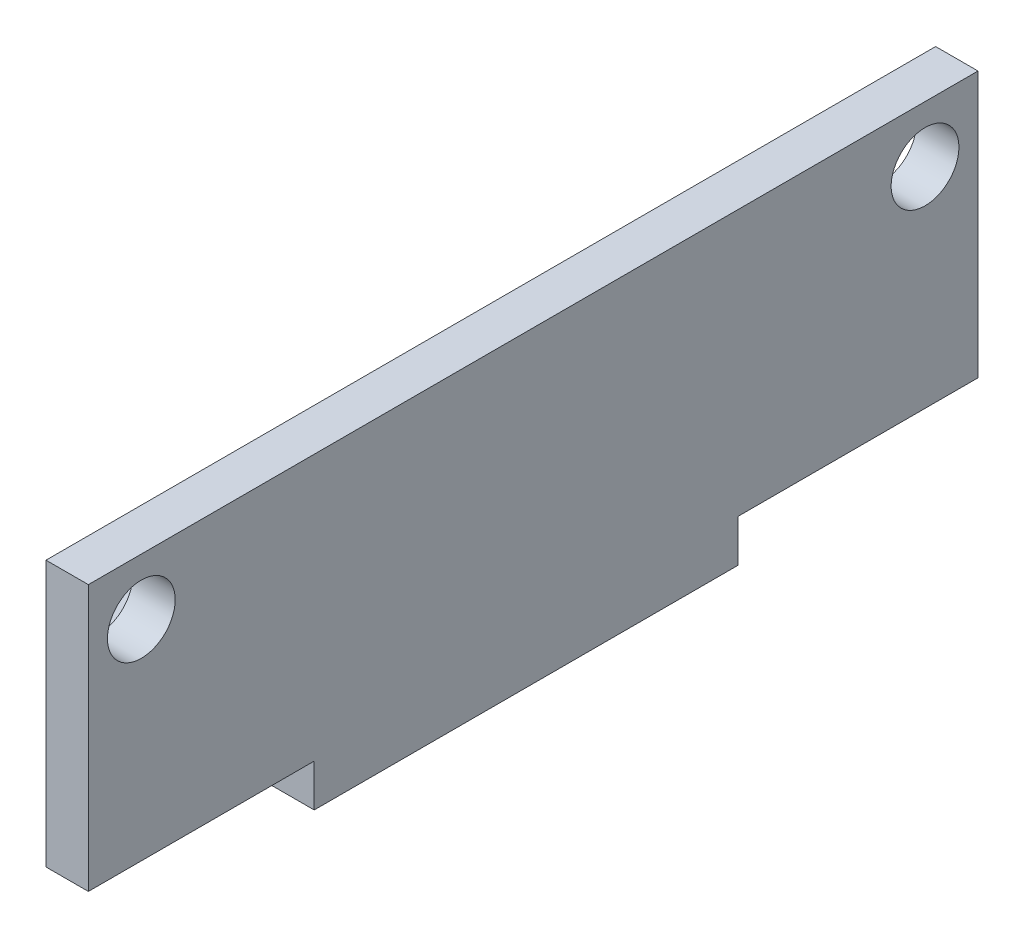
ISO-10303-21;
HEADER;
FILE_DESCRIPTION(('STEP AP214'),'2;1');
FILE_NAME('part.step','',(''),(''),'','','');
FILE_SCHEMA(('AUTOMOTIVE_DESIGN { 1 0 10303 214 1 1 1 1 }'));
ENDSEC;
DATA;
#1=APPLICATION_CONTEXT('core data for automotive mechanical design processes');
#2=APPLICATION_PROTOCOL_DEFINITION('international standard','automotive_design',2000,#1);
#3=PRODUCT_CONTEXT('',#1,'mechanical');
#4=PRODUCT('Part','Part','',(#3));
#5=PRODUCT_RELATED_PRODUCT_CATEGORY('part','',(#4));
#6=PRODUCT_DEFINITION_FORMATION('','',#4);
#7=PRODUCT_DEFINITION_CONTEXT('part definition',#1,'design');
#8=PRODUCT_DEFINITION('design','',#6,#7);
#9=PRODUCT_DEFINITION_SHAPE('','',#8);
#10=(LENGTH_UNIT() NAMED_UNIT(*) SI_UNIT(.MILLI.,.METRE.));
#11=(NAMED_UNIT(*) PLANE_ANGLE_UNIT() SI_UNIT($,.RADIAN.));
#12=(NAMED_UNIT(*) SI_UNIT($,.STERADIAN.) SOLID_ANGLE_UNIT());
#13=UNCERTAINTY_MEASURE_WITH_UNIT(LENGTH_MEASURE(1.E-05),#10,'distance_accuracy_value','');
#14=(GEOMETRIC_REPRESENTATION_CONTEXT(3) GLOBAL_UNCERTAINTY_ASSIGNED_CONTEXT((#13)) GLOBAL_UNIT_ASSIGNED_CONTEXT((#10,
#11,#12)) REPRESENTATION_CONTEXT('',''));
#15=CARTESIAN_POINT('',(0.,0.,0.));
#16=DIRECTION('',(0.,0.,1.));
#17=DIRECTION('',(1.,0.,0.));
#18=AXIS2_PLACEMENT_3D('',#15,#16,#17);
#19=CARTESIAN_POINT('',(6.,2.,10.));
#20=DIRECTION('',(-1.,0.,0.));
#21=DIRECTION('',(0.,0.,1.));
#22=AXIS2_PLACEMENT_3D('',#19,#20,#21);
#23=PLANE('',#22);
#24=CARTESIAN_POINT('',(6.,11.8823235568186,-18.8376761787308));
#25=DIRECTION('',(1.,0.,0.));
#26=DIRECTION('',(0.,0.,-1.));
#27=AXIS2_PLACEMENT_3D('',#24,#25,#26);
#28=CIRCLE('',#27,1.6);
#29=CARTESIAN_POINT('',(6.,11.8823235568186,-20.4376761787308));
#30=VERTEX_POINT('',#29);
#31=EDGE_CURVE('E172',#30,#30,#28,.T.);
#32=ORIENTED_EDGE('',*,*,#31,.F.);
#33=EDGE_LOOP('',(#32));
#34=FACE_BOUND('',#33,.T.);
#35=CARTESIAN_POINT('',(6.,11.8823235568186,18.1623238212692));
#36=DIRECTION('',(1.,0.,0.));
#37=DIRECTION('',(0.,0.,-1.));
#38=AXIS2_PLACEMENT_3D('',#35,#36,#37);
#39=CIRCLE('',#38,1.6);
#40=CARTESIAN_POINT('',(6.,11.8823235568186,16.5623238212692));
#41=VERTEX_POINT('',#40);
#42=EDGE_CURVE('E168',#41,#41,#39,.T.);
#43=ORIENTED_EDGE('',*,*,#42,.F.);
#44=EDGE_LOOP('',(#43));
#45=FACE_BOUND('',#44,.T.);
#46=DIRECTION('',(0.,-1.,0.));
#47=VECTOR('',#46,1.);
#48=CARTESIAN_POINT('',(6.,22.,-21.3376761787308));
#49=LINE('',#48,#47);
#50=CARTESIAN_POINT('',(6.,14.5454240515832,-21.3376761787308));
#51=VERTEX_POINT('',#50);
#52=CARTESIAN_POINT('',(6.,2.,-21.3376761787308));
#53=VERTEX_POINT('',#52);
#54=EDGE_CURVE('E123',#51,#53,#49,.T.);
#55=ORIENTED_EDGE('',*,*,#54,.F.);
#56=DIRECTION('',(0.,0.,-1.));
#57=VECTOR('',#56,1.);
#58=CARTESIAN_POINT('',(6.,14.5454240515832,20.6623238212692));
#59=LINE('',#58,#57);
#60=CARTESIAN_POINT('',(6.,14.5454240515832,20.6623238212692));
#61=VERTEX_POINT('',#60);
#62=EDGE_CURVE('E55',#61,#51,#59,.T.);
#63=ORIENTED_EDGE('',*,*,#62,.F.);
#64=DIRECTION('',(0.,-1.,0.));
#65=VECTOR('',#64,1.);
#66=CARTESIAN_POINT('',(6.,22.,20.6623238212692));
#67=LINE('',#66,#65);
#68=CARTESIAN_POINT('',(6.,2.,20.6623238212692));
#69=VERTEX_POINT('',#68);
#70=EDGE_CURVE('E120',#61,#69,#67,.T.);
#71=ORIENTED_EDGE('',*,*,#70,.T.);
#72=DIRECTION('',(0.,0.,-1.));
#73=VECTOR('',#72,1.);
#74=CARTESIAN_POINT('',(6.,2.,0.));
#75=LINE('',#74,#73);
#76=CARTESIAN_POINT('',(6.,2.,10.));
#77=VERTEX_POINT('',#76);
#78=EDGE_CURVE('E138',#69,#77,#75,.T.);
#79=ORIENTED_EDGE('',*,*,#78,.T.);
#80=DIRECTION('',(0.,-1.,0.));
#81=VECTOR('',#80,1.);
#82=CARTESIAN_POINT('',(6.,2.,10.));
#83=LINE('',#82,#81);
#84=CARTESIAN_POINT('',(6.,0.,10.));
#85=VERTEX_POINT('',#84);
#86=EDGE_CURVE('E218',#77,#85,#83,.T.);
#87=ORIENTED_EDGE('',*,*,#86,.T.);
#88=DIRECTION('',(0.,0.,-1.));
#89=VECTOR('',#88,1.);
#90=CARTESIAN_POINT('',(6.,0.,10.));
#91=LINE('',#90,#89);
#92=CARTESIAN_POINT('',(6.,0.,-10.));
#93=VERTEX_POINT('',#92);
#94=EDGE_CURVE('E132',#85,#93,#91,.T.);
#95=ORIENTED_EDGE('',*,*,#94,.T.);
#96=DIRECTION('',(0.,-1.,0.));
#97=VECTOR('',#96,1.);
#98=CARTESIAN_POINT('',(6.,2.,-10.));
#99=LINE('',#98,#97);
#100=CARTESIAN_POINT('',(6.,2.,-10.));
#101=VERTEX_POINT('',#100);
#102=EDGE_CURVE('E45',#101,#93,#99,.T.);
#103=ORIENTED_EDGE('',*,*,#102,.F.);
#104=EDGE_CURVE('E142',#101,#53,#75,.T.);
#105=ORIENTED_EDGE('',*,*,#104,.T.);
#106=EDGE_LOOP('',(#55,#63,#71,#79,#87,#95,#103,#105));
#107=FACE_BOUND('',#106,.T.);
#108=ADVANCED_FACE('F37',(#34,#45,#107),#23,.F.);
#109=CARTESIAN_POINT('',(-6.,2.,-10.));
#110=DIRECTION('',(0.,0.,1.));
#111=DIRECTION('',(1.,0.,0.));
#112=AXIS2_PLACEMENT_3D('',#109,#110,#111);
#113=PLANE('',#112);
#114=DIRECTION('',(-1.,0.,0.));
#115=VECTOR('',#114,1.);
#116=CARTESIAN_POINT('',(-6.,0.,-10.));
#117=LINE('',#116,#115);
#118=CARTESIAN_POINT('',(-6.,0.,-10.));
#119=VERTEX_POINT('',#118);
#120=EDGE_CURVE('E201',#93,#119,#117,.T.);
#121=ORIENTED_EDGE('',*,*,#120,.T.);
#122=DIRECTION('',(0.,-1.,0.));
#123=VECTOR('',#122,1.);
#124=CARTESIAN_POINT('',(-6.,2.,-10.));
#125=LINE('',#124,#123);
#126=CARTESIAN_POINT('',(-6.,2.,-10.));
#127=VERTEX_POINT('',#126);
#128=EDGE_CURVE('E217',#127,#119,#125,.T.);
#129=ORIENTED_EDGE('',*,*,#128,.F.);
#130=DIRECTION('',(-1.,0.,0.));
#131=VECTOR('',#130,1.);
#132=CARTESIAN_POINT('',(-6.,2.,-10.));
#133=LINE('',#132,#131);
#134=CARTESIAN_POINT('',(4.,2.,-10.));
#135=VERTEX_POINT('',#134);
#136=EDGE_CURVE('E213',#135,#127,#133,.T.);
#137=ORIENTED_EDGE('',*,*,#136,.F.);
#138=EDGE_CURVE('E157',#101,#135,#133,.T.);
#139=ORIENTED_EDGE('',*,*,#138,.F.);
#140=ORIENTED_EDGE('',*,*,#102,.T.);
#141=EDGE_LOOP('',(#121,#129,#137,#139,#140));
#142=FACE_BOUND('',#141,.T.);
#143=ADVANCED_FACE('F244',(#142),#113,.F.);
#144=CARTESIAN_POINT('',(-6.,2.,10.));
#145=DIRECTION('',(1.,0.,0.));
#146=DIRECTION('',(0.,0.,-1.));
#147=AXIS2_PLACEMENT_3D('',#144,#145,#146);
#148=PLANE('',#147);
#149=DIRECTION('',(0.,0.,1.));
#150=VECTOR('',#149,1.);
#151=CARTESIAN_POINT('',(-6.,0.,10.));
#152=LINE('',#151,#150);
#153=CARTESIAN_POINT('',(-6.,0.,10.));
#154=VERTEX_POINT('',#153);
#155=EDGE_CURVE('E204',#119,#154,#152,.T.);
#156=ORIENTED_EDGE('',*,*,#155,.T.);
#157=DIRECTION('',(0.,-1.,0.));
#158=VECTOR('',#157,1.);
#159=CARTESIAN_POINT('',(-6.,2.,10.));
#160=LINE('',#159,#158);
#161=CARTESIAN_POINT('',(-6.,2.,10.));
#162=VERTEX_POINT('',#161);
#163=EDGE_CURVE('E214',#162,#154,#160,.T.);
#164=ORIENTED_EDGE('',*,*,#163,.F.);
#165=DIRECTION('',(0.,0.,1.));
#166=VECTOR('',#165,1.);
#167=CARTESIAN_POINT('',(-6.,2.,10.));
#168=LINE('',#167,#166);
#169=EDGE_CURVE('E223',#127,#162,#168,.T.);
#170=ORIENTED_EDGE('',*,*,#169,.F.);
#171=ORIENTED_EDGE('',*,*,#128,.T.);
#172=EDGE_LOOP('',(#156,#164,#170,#171));
#173=FACE_BOUND('',#172,.T.);
#174=ADVANCED_FACE('F238',(#173),#148,.F.);
#175=CARTESIAN_POINT('',(-6.,2.,10.));
#176=DIRECTION('',(0.,0.,-1.));
#177=DIRECTION('',(-1.,0.,0.));
#178=AXIS2_PLACEMENT_3D('',#175,#176,#177);
#179=PLANE('',#178);
#180=DIRECTION('',(1.,0.,0.));
#181=VECTOR('',#180,1.);
#182=CARTESIAN_POINT('',(-6.,0.,10.));
#183=LINE('',#182,#181);
#184=EDGE_CURVE('E200',#154,#85,#183,.T.);
#185=ORIENTED_EDGE('',*,*,#184,.T.);
#186=ORIENTED_EDGE('',*,*,#86,.F.);
#187=DIRECTION('',(1.,0.,0.));
#188=VECTOR('',#187,1.);
#189=CARTESIAN_POINT('',(-6.,2.,10.));
#190=LINE('',#189,#188);
#191=CARTESIAN_POINT('',(4.,2.,10.));
#192=VERTEX_POINT('',#191);
#193=EDGE_CURVE('E221',#192,#77,#190,.T.);
#194=ORIENTED_EDGE('',*,*,#193,.F.);
#195=EDGE_CURVE('E207',#162,#192,#190,.T.);
#196=ORIENTED_EDGE('',*,*,#195,.F.);
#197=ORIENTED_EDGE('',*,*,#163,.T.);
#198=EDGE_LOOP('',(#185,#186,#194,#196,#197));
#199=FACE_BOUND('',#198,.T.);
#200=ADVANCED_FACE('F240',(#199),#179,.F.);
#201=CARTESIAN_POINT('',(0.,2.,0.));
#202=DIRECTION('',(0.,-1.,0.));
#203=DIRECTION('',(0.,0.,-1.));
#204=AXIS2_PLACEMENT_3D('',#201,#202,#203);
#205=PLANE('',#204);
#206=CARTESIAN_POINT('',(-2.62039814525394,2.,5.));
#207=DIRECTION('',(0.,1.,0.));
#208=DIRECTION('',(0.,0.,1.));
#209=AXIS2_PLACEMENT_3D('',#206,#207,#208);
#210=CIRCLE('',#209,1.6);
#211=CARTESIAN_POINT('',(-2.62039814525394,2.,6.6));
#212=VERTEX_POINT('',#211);
#213=EDGE_CURVE('E180',#212,#212,#210,.T.);
#214=ORIENTED_EDGE('',*,*,#213,.F.);
#215=EDGE_LOOP('',(#214));
#216=FACE_BOUND('',#215,.T.);
#217=CARTESIAN_POINT('',(-2.62039814525394,2.,-5.));
#218=DIRECTION('',(0.,1.,0.));
#219=DIRECTION('',(0.,0.,1.));
#220=AXIS2_PLACEMENT_3D('',#217,#218,#219);
#221=CIRCLE('',#220,1.6);
#222=CARTESIAN_POINT('',(-2.62039814525394,2.,-3.4));
#223=VERTEX_POINT('',#222);
#224=EDGE_CURVE('E177',#223,#223,#221,.T.);
#225=ORIENTED_EDGE('',*,*,#224,.F.);
#226=EDGE_LOOP('',(#225));
#227=FACE_BOUND('',#226,.T.);
#228=ORIENTED_EDGE('',*,*,#195,.T.);
#229=DIRECTION('',(0.,0.,-1.));
#230=VECTOR('',#229,1.);
#231=CARTESIAN_POINT('',(4.,2.,0.));
#232=LINE('',#231,#230);
#233=EDGE_CURVE('E11',#192,#135,#232,.T.);
#234=ORIENTED_EDGE('',*,*,#233,.T.);
#235=ORIENTED_EDGE('',*,*,#136,.T.);
#236=ORIENTED_EDGE('',*,*,#169,.T.);
#237=EDGE_LOOP('',(#228,#234,#235,#236));
#238=FACE_BOUND('',#237,.T.);
#239=ADVANCED_FACE('F192',(#216,#227,#238),#205,.F.);
#240=CARTESIAN_POINT('',(0.,0.,0.));
#241=DIRECTION('',(0.,-1.,0.));
#242=DIRECTION('',(0.,0.,-1.));
#243=AXIS2_PLACEMENT_3D('',#240,#241,#242);
#244=PLANE('',#243);
#245=CARTESIAN_POINT('',(-2.62039814525394,0.,5.));
#246=DIRECTION('',(0.,-1.,0.));
#247=DIRECTION('',(0.,0.,-1.));
#248=AXIS2_PLACEMENT_3D('',#245,#246,#247);
#249=CIRCLE('',#248,1.6);
#250=CARTESIAN_POINT('',(-2.62039814525394,0.,3.4));
#251=VERTEX_POINT('',#250);
#252=EDGE_CURVE('E40',#251,#251,#249,.T.);
#253=ORIENTED_EDGE('',*,*,#252,.F.);
#254=EDGE_LOOP('',(#253));
#255=FACE_BOUND('',#254,.T.);
#256=CARTESIAN_POINT('',(-2.62039814525394,0.,-5.));
#257=DIRECTION('',(0.,-1.,0.));
#258=DIRECTION('',(0.,0.,-1.));
#259=AXIS2_PLACEMENT_3D('',#256,#257,#258);
#260=CIRCLE('',#259,1.6);
#261=CARTESIAN_POINT('',(-2.62039814525394,0.,-6.6));
#262=VERTEX_POINT('',#261);
#263=EDGE_CURVE('E124',#262,#262,#260,.T.);
#264=ORIENTED_EDGE('',*,*,#263,.F.);
#265=EDGE_LOOP('',(#264));
#266=FACE_BOUND('',#265,.T.);
#267=ORIENTED_EDGE('',*,*,#94,.F.);
#268=ORIENTED_EDGE('',*,*,#184,.F.);
#269=ORIENTED_EDGE('',*,*,#155,.F.);
#270=ORIENTED_EDGE('',*,*,#120,.F.);
#271=EDGE_LOOP('',(#267,#268,#269,#270));
#272=FACE_BOUND('',#271,.T.);
#273=ADVANCED_FACE('F189',(#255,#266,#272),#244,.T.);
#274=CARTESIAN_POINT('',(0.,2.,0.));
#275=DIRECTION('',(0.,1.,0.));
#276=DIRECTION('',(0.,0.,1.));
#277=AXIS2_PLACEMENT_3D('',#274,#275,#276);
#278=PLANE('',#277);
#279=ORIENTED_EDGE('',*,*,#104,.F.);
#280=ORIENTED_EDGE('',*,*,#138,.T.);
#281=CARTESIAN_POINT('',(4.,2.,-21.3376761787308));
#282=VERTEX_POINT('',#281);
#283=EDGE_CURVE('E48',#135,#282,#232,.T.);
#284=ORIENTED_EDGE('',*,*,#283,.T.);
#285=DIRECTION('',(1.,0.,0.));
#286=VECTOR('',#285,1.);
#287=CARTESIAN_POINT('',(0.,2.,-21.3376761787308));
#288=LINE('',#287,#286);
#289=EDGE_CURVE('E141',#282,#53,#288,.T.);
#290=ORIENTED_EDGE('',*,*,#289,.T.);
#291=EDGE_LOOP('',(#279,#280,#284,#290));
#292=FACE_BOUND('',#291,.T.);
#293=ADVANCED_FACE('F155',(#292),#278,.F.);
#294=CARTESIAN_POINT('',(4.,2.,20.6623238212692));
#295=VERTEX_POINT('',#294);
#296=EDGE_CURVE('E47',#295,#192,#232,.T.);
#297=ORIENTED_EDGE('',*,*,#296,.T.);
#298=ORIENTED_EDGE('',*,*,#193,.T.);
#299=ORIENTED_EDGE('',*,*,#78,.F.);
#300=DIRECTION('',(1.,0.,0.));
#301=VECTOR('',#300,1.);
#302=CARTESIAN_POINT('',(0.,2.,20.6623238212692));
#303=LINE('',#302,#301);
#304=EDGE_CURVE('E128',#295,#69,#303,.T.);
#305=ORIENTED_EDGE('',*,*,#304,.F.);
#306=EDGE_LOOP('',(#297,#298,#299,#305));
#307=FACE_BOUND('',#306,.T.);
#308=ADVANCED_FACE('F242',(#307),#278,.F.);
#309=CARTESIAN_POINT('',(4.,22.,0.));
#310=DIRECTION('',(-1.,0.,0.));
#311=DIRECTION('',(0.,0.,1.));
#312=AXIS2_PLACEMENT_3D('',#309,#310,#311);
#313=PLANE('',#312);
#314=DIRECTION('',(0.,0.,1.));
#315=VECTOR('',#314,1.);
#316=CARTESIAN_POINT('',(4.,14.5454240515832,0.));
#317=LINE('',#316,#315);
#318=CARTESIAN_POINT('',(4.,14.5454240515832,-21.3376761787308));
#319=VERTEX_POINT('',#318);
#320=CARTESIAN_POINT('',(4.,14.5454240515832,20.6623238212692));
#321=VERTEX_POINT('',#320);
#322=EDGE_CURVE('E111',#319,#321,#317,.T.);
#323=ORIENTED_EDGE('',*,*,#322,.F.);
#324=DIRECTION('',(0.,-1.,0.));
#325=VECTOR('',#324,1.);
#326=CARTESIAN_POINT('',(4.,22.,-21.3376761787308));
#327=LINE('',#326,#325);
#328=EDGE_CURVE('E134',#319,#282,#327,.T.);
#329=ORIENTED_EDGE('',*,*,#328,.T.);
#330=ORIENTED_EDGE('',*,*,#283,.F.);
#331=ORIENTED_EDGE('',*,*,#233,.F.);
#332=ORIENTED_EDGE('',*,*,#296,.F.);
#333=DIRECTION('',(0.,-1.,0.));
#334=VECTOR('',#333,1.);
#335=CARTESIAN_POINT('',(4.,22.,20.6623238212692));
#336=LINE('',#335,#334);
#337=EDGE_CURVE('E130',#321,#295,#336,.T.);
#338=ORIENTED_EDGE('',*,*,#337,.F.);
#339=EDGE_LOOP('',(#323,#329,#330,#331,#332,#338));
#340=FACE_BOUND('',#339,.T.);
#341=CARTESIAN_POINT('',(4.,11.8823235568186,-18.8376761787308));
#342=DIRECTION('',(-1.,0.,0.));
#343=DIRECTION('',(0.,0.,1.));
#344=AXIS2_PLACEMENT_3D('',#341,#342,#343);
#345=CIRCLE('',#344,1.6);
#346=CARTESIAN_POINT('',(4.,11.8823235568186,-17.2376761787308));
#347=VERTEX_POINT('',#346);
#348=EDGE_CURVE('E171',#347,#347,#345,.T.);
#349=ORIENTED_EDGE('',*,*,#348,.F.);
#350=EDGE_LOOP('',(#349));
#351=FACE_BOUND('',#350,.T.);
#352=CARTESIAN_POINT('',(4.,11.8823235568186,18.1623238212692));
#353=DIRECTION('',(-1.,0.,0.));
#354=DIRECTION('',(0.,0.,1.));
#355=AXIS2_PLACEMENT_3D('',#352,#353,#354);
#356=CIRCLE('',#355,1.6);
#357=CARTESIAN_POINT('',(4.,11.8823235568186,19.7623238212692));
#358=VERTEX_POINT('',#357);
#359=EDGE_CURVE('E158',#358,#358,#356,.T.);
#360=ORIENTED_EDGE('',*,*,#359,.F.);
#361=EDGE_LOOP('',(#360));
#362=FACE_BOUND('',#361,.T.);
#363=ADVANCED_FACE('F150',(#340,#351,#362),#313,.T.);
#364=CARTESIAN_POINT('',(0.,22.,20.6623238212692));
#365=DIRECTION('',(0.,0.,-1.));
#366=DIRECTION('',(-1.,0.,0.));
#367=AXIS2_PLACEMENT_3D('',#364,#365,#366);
#368=PLANE('',#367);
#369=ORIENTED_EDGE('',*,*,#70,.F.);
#370=DIRECTION('',(1.,0.,0.));
#371=VECTOR('',#370,1.);
#372=CARTESIAN_POINT('',(-14.,14.5454240515832,20.6623238212692));
#373=LINE('',#372,#371);
#374=EDGE_CURVE('E108',#321,#61,#373,.T.);
#375=ORIENTED_EDGE('',*,*,#374,.F.);
#376=ORIENTED_EDGE('',*,*,#337,.T.);
#377=ORIENTED_EDGE('',*,*,#304,.T.);
#378=EDGE_LOOP('',(#369,#375,#376,#377));
#379=FACE_BOUND('',#378,.T.);
#380=ADVANCED_FACE('F126',(#379),#368,.F.);
#381=CARTESIAN_POINT('',(0.,22.,-21.3376761787308));
#382=DIRECTION('',(0.,0.,-1.));
#383=DIRECTION('',(-1.,0.,0.));
#384=AXIS2_PLACEMENT_3D('',#381,#382,#383);
#385=PLANE('',#384);
#386=DIRECTION('',(1.,0.,0.));
#387=VECTOR('',#386,1.);
#388=CARTESIAN_POINT('',(-14.,14.5454240515832,-21.3376761787308));
#389=LINE('',#388,#387);
#390=EDGE_CURVE('E115',#319,#51,#389,.T.);
#391=ORIENTED_EDGE('',*,*,#390,.T.);
#392=ORIENTED_EDGE('',*,*,#54,.T.);
#393=ORIENTED_EDGE('',*,*,#289,.F.);
#394=ORIENTED_EDGE('',*,*,#328,.F.);
#395=EDGE_LOOP('',(#391,#392,#393,#394));
#396=FACE_BOUND('',#395,.T.);
#397=ADVANCED_FACE('F159',(#396),#385,.T.);
#398=CARTESIAN_POINT('',(-14.,11.8823235568186,18.1623238212692));
#399=DIRECTION('',(1.,0.,0.));
#400=DIRECTION('',(0.,0.,-1.));
#401=AXIS2_PLACEMENT_3D('',#398,#399,#400);
#402=CYLINDRICAL_SURFACE('',#401,1.6);
#403=ORIENTED_EDGE('',*,*,#359,.T.);
#404=EDGE_LOOP('',(#403));
#405=FACE_BOUND('',#404,.T.);
#406=ORIENTED_EDGE('',*,*,#42,.T.);
#407=EDGE_LOOP('',(#406));
#408=FACE_BOUND('',#407,.T.);
#409=ADVANCED_FACE('F264',(#405,#408),#402,.F.);
#410=CARTESIAN_POINT('',(-14.,11.8823235568186,-18.8376761787308));
#411=DIRECTION('',(1.,0.,0.));
#412=DIRECTION('',(0.,0.,-1.));
#413=AXIS2_PLACEMENT_3D('',#410,#411,#412);
#414=CYLINDRICAL_SURFACE('',#413,1.6);
#415=ORIENTED_EDGE('',*,*,#348,.T.);
#416=EDGE_LOOP('',(#415));
#417=FACE_BOUND('',#416,.T.);
#418=ORIENTED_EDGE('',*,*,#31,.T.);
#419=EDGE_LOOP('',(#418));
#420=FACE_BOUND('',#419,.T.);
#421=ADVANCED_FACE('F269',(#417,#420),#414,.F.);
#422=CARTESIAN_POINT('',(-14.,14.5454240515832,20.6623238212692));
#423=DIRECTION('',(0.,-1.,0.));
#424=DIRECTION('',(0.,0.,-1.));
#425=AXIS2_PLACEMENT_3D('',#422,#423,#424);
#426=PLANE('',#425);
#427=ORIENTED_EDGE('',*,*,#322,.T.);
#428=ORIENTED_EDGE('',*,*,#374,.T.);
#429=ORIENTED_EDGE('',*,*,#62,.T.);
#430=ORIENTED_EDGE('',*,*,#390,.F.);
#431=EDGE_LOOP('',(#427,#428,#429,#430));
#432=FACE_BOUND('',#431,.T.);
#433=ADVANCED_FACE('F109',(#432),#426,.F.);
#434=CARTESIAN_POINT('',(-2.62039814525394,-8.,-5.));
#435=DIRECTION('',(0.,1.,0.));
#436=DIRECTION('',(0.,0.,1.));
#437=AXIS2_PLACEMENT_3D('',#434,#435,#436);
#438=CYLINDRICAL_SURFACE('',#437,1.6);
#439=ORIENTED_EDGE('',*,*,#263,.T.);
#440=EDGE_LOOP('',(#439));
#441=FACE_BOUND('',#440,.T.);
#442=ORIENTED_EDGE('',*,*,#224,.T.);
#443=EDGE_LOOP('',(#442));
#444=FACE_BOUND('',#443,.T.);
#445=ADVANCED_FACE('F276',(#441,#444),#438,.F.);
#446=CARTESIAN_POINT('',(-2.62039814525394,-8.,5.));
#447=DIRECTION('',(0.,1.,0.));
#448=DIRECTION('',(0.,0.,1.));
#449=AXIS2_PLACEMENT_3D('',#446,#447,#448);
#450=CYLINDRICAL_SURFACE('',#449,1.6);
#451=ORIENTED_EDGE('',*,*,#252,.T.);
#452=EDGE_LOOP('',(#451));
#453=FACE_BOUND('',#452,.T.);
#454=ORIENTED_EDGE('',*,*,#213,.T.);
#455=EDGE_LOOP('',(#454));
#456=FACE_BOUND('',#455,.T.);
#457=ADVANCED_FACE('F187',(#453,#456),#450,.F.);
#458=CLOSED_SHELL('',(#108,#143,#174,#200,#239,#273,#293,#308,#363,#380,#397,#409,#421,#433,
#445,#457));
#459=MANIFOLD_SOLID_BREP('B2',#458);
#460=ADVANCED_BREP_SHAPE_REPRESENTATION('',(#18,#459),#14);
#461=SHAPE_DEFINITION_REPRESENTATION(#9,#460);
ENDSEC;
END-ISO-10303-21;
